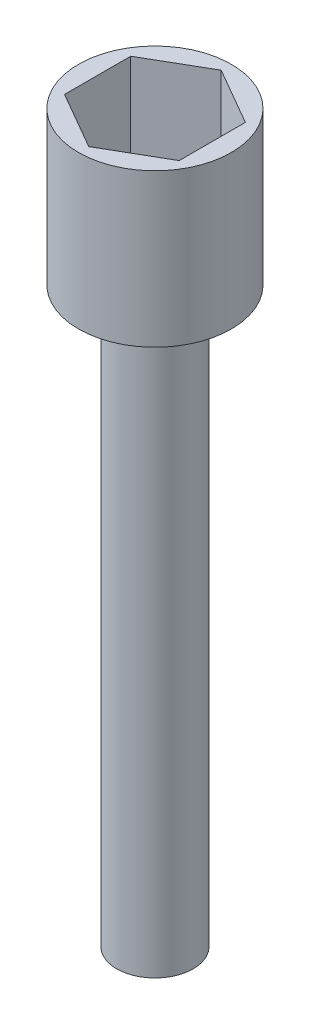
ISO-10303-21;
HEADER;
FILE_DESCRIPTION(('STEP AP214'),'2;1');
FILE_NAME('part.step','',(''),(''),'','','');
FILE_SCHEMA(('AUTOMOTIVE_DESIGN { 1 0 10303 214 1 1 1 1 }'));
ENDSEC;
DATA;
#1=APPLICATION_CONTEXT('core data for automotive mechanical design processes');
#2=APPLICATION_PROTOCOL_DEFINITION('international standard','automotive_design',2000,#1);
#3=PRODUCT_CONTEXT('',#1,'mechanical');
#4=PRODUCT('Part','Part','',(#3));
#5=PRODUCT_RELATED_PRODUCT_CATEGORY('part','',(#4));
#6=PRODUCT_DEFINITION_FORMATION('','',#4);
#7=PRODUCT_DEFINITION_CONTEXT('part definition',#1,'design');
#8=PRODUCT_DEFINITION('design','',#6,#7);
#9=PRODUCT_DEFINITION_SHAPE('','',#8);
#10=(LENGTH_UNIT() NAMED_UNIT(*) SI_UNIT(.MILLI.,.METRE.));
#11=(NAMED_UNIT(*) PLANE_ANGLE_UNIT() SI_UNIT($,.RADIAN.));
#12=(NAMED_UNIT(*) SI_UNIT($,.STERADIAN.) SOLID_ANGLE_UNIT());
#13=UNCERTAINTY_MEASURE_WITH_UNIT(LENGTH_MEASURE(1.E-05),#10,'distance_accuracy_value','');
#14=(GEOMETRIC_REPRESENTATION_CONTEXT(3) GLOBAL_UNCERTAINTY_ASSIGNED_CONTEXT((#13)) GLOBAL_UNIT_ASSIGNED_CONTEXT((#10,
#11,#12)) REPRESENTATION_CONTEXT('',''));
#15=CARTESIAN_POINT('',(0.,0.,0.));
#16=DIRECTION('',(0.,0.,1.));
#17=DIRECTION('',(1.,0.,0.));
#18=AXIS2_PLACEMENT_3D('',#15,#16,#17);
#19=CARTESIAN_POINT('',(0.,15.,0.));
#20=DIRECTION('',(0.,-1.,0.));
#21=DIRECTION('',(0.,0.,-1.));
#22=AXIS2_PLACEMENT_3D('',#19,#20,#21);
#23=CYLINDRICAL_SURFACE('',#22,1.);
#24=CARTESIAN_POINT('',(0.,15.,0.));
#25=DIRECTION('',(0.,1.,0.));
#26=DIRECTION('',(0.,0.,1.));
#27=AXIS2_PLACEMENT_3D('',#24,#25,#26);
#28=CIRCLE('',#27,1.);
#29=CARTESIAN_POINT('',(0.,15.,1.));
#30=VERTEX_POINT('',#29);
#31=EDGE_CURVE('E11',#30,#30,#28,.T.);
#32=ORIENTED_EDGE('',*,*,#31,.F.);
#33=EDGE_LOOP('',(#32));
#34=FACE_BOUND('',#33,.T.);
#35=CARTESIAN_POINT('',(0.,0.,0.));
#36=DIRECTION('',(0.,1.,0.));
#37=DIRECTION('',(0.,0.,1.));
#38=AXIS2_PLACEMENT_3D('',#35,#36,#37);
#39=CIRCLE('',#38,1.);
#40=CARTESIAN_POINT('',(0.,0.,1.));
#41=VERTEX_POINT('',#40);
#42=EDGE_CURVE('E35',#41,#41,#39,.T.);
#43=ORIENTED_EDGE('',*,*,#42,.T.);
#44=EDGE_LOOP('',(#43));
#45=FACE_BOUND('',#44,.T.);
#46=ADVANCED_FACE('F32',(#34,#45),#23,.T.);
#47=CARTESIAN_POINT('',(0.,0.,0.));
#48=DIRECTION('',(0.,1.,0.));
#49=DIRECTION('',(0.,0.,1.));
#50=AXIS2_PLACEMENT_3D('',#47,#48,#49);
#51=PLANE('',#50);
#52=ORIENTED_EDGE('',*,*,#42,.F.);
#53=EDGE_LOOP('',(#52));
#54=FACE_BOUND('',#53,.T.);
#55=ADVANCED_FACE('F150',(#54),#51,.F.);
#56=CARTESIAN_POINT('',(0.,15.,0.));
#57=DIRECTION('',(0.,1.,0.));
#58=DIRECTION('',(0.,0.,1.));
#59=AXIS2_PLACEMENT_3D('',#56,#57,#58);
#60=PLANE('',#59);
#61=CARTESIAN_POINT('',(0.,15.,0.));
#62=DIRECTION('',(0.,1.,0.));
#63=DIRECTION('',(0.,0.,1.));
#64=AXIS2_PLACEMENT_3D('',#61,#62,#63);
#65=CIRCLE('',#64,2.);
#66=CARTESIAN_POINT('',(0.,15.,2.));
#67=VERTEX_POINT('',#66);
#68=EDGE_CURVE('E133',#67,#67,#65,.T.);
#69=ORIENTED_EDGE('',*,*,#68,.F.);
#70=EDGE_LOOP('',(#69));
#71=FACE_BOUND('',#70,.T.);
#72=ORIENTED_EDGE('',*,*,#31,.T.);
#73=EDGE_LOOP('',(#72));
#74=FACE_BOUND('',#73,.T.);
#75=ADVANCED_FACE('F147',(#71,#74),#60,.F.);
#76=CARTESIAN_POINT('',(0.,19.,0.));
#77=DIRECTION('',(0.,-1.,0.));
#78=DIRECTION('',(0.,0.,-1.));
#79=AXIS2_PLACEMENT_3D('',#76,#77,#78);
#80=CYLINDRICAL_SURFACE('',#79,2.);
#81=CARTESIAN_POINT('',(0.,19.,0.));
#82=DIRECTION('',(0.,1.,0.));
#83=DIRECTION('',(0.,0.,1.));
#84=AXIS2_PLACEMENT_3D('',#81,#82,#83);
#85=CIRCLE('',#84,2.);
#86=CARTESIAN_POINT('',(0.,19.,2.));
#87=VERTEX_POINT('',#86);
#88=EDGE_CURVE('E139',#87,#87,#85,.T.);
#89=ORIENTED_EDGE('',*,*,#88,.F.);
#90=EDGE_LOOP('',(#89));
#91=FACE_BOUND('',#90,.T.);
#92=ORIENTED_EDGE('',*,*,#68,.T.);
#93=EDGE_LOOP('',(#92));
#94=FACE_BOUND('',#93,.T.);
#95=ADVANCED_FACE('F145',(#91,#94),#80,.T.);
#96=CARTESIAN_POINT('',(0.,19.,0.));
#97=DIRECTION('',(0.,1.,0.));
#98=DIRECTION('',(0.,0.,1.));
#99=AXIS2_PLACEMENT_3D('',#96,#97,#98);
#100=PLANE('',#99);
#101=DIRECTION('',(-0.866025403784439,0.,-0.5));
#102=VECTOR('',#101,1.);
#103=CARTESIAN_POINT('',(1.5,19.,-0.86602540378444));
#104=LINE('',#103,#102);
#105=CARTESIAN_POINT('',(1.5,19.,-0.86602540378444));
#106=VERTEX_POINT('',#105);
#107=CARTESIAN_POINT('',(0.,19.,-1.73205080756888));
#108=VERTEX_POINT('',#107);
#109=EDGE_CURVE('E46',#106,#108,#104,.T.);
#110=ORIENTED_EDGE('',*,*,#109,.F.);
#111=DIRECTION('',(0.,0.,-1.));
#112=VECTOR('',#111,1.);
#113=CARTESIAN_POINT('',(1.5,19.,0.866025403784438));
#114=LINE('',#113,#112);
#115=CARTESIAN_POINT('',(1.5,19.,0.866025403784438));
#116=VERTEX_POINT('',#115);
#117=EDGE_CURVE('E129',#116,#106,#114,.T.);
#118=ORIENTED_EDGE('',*,*,#117,.F.);
#119=DIRECTION('',(0.866025403784439,0.,-0.5));
#120=VECTOR('',#119,1.);
#121=CARTESIAN_POINT('',(0.,19.,1.73205080756888));
#122=LINE('',#121,#120);
#123=CARTESIAN_POINT('',(0.,19.,1.73205080756888));
#124=VERTEX_POINT('',#123);
#125=EDGE_CURVE('E127',#124,#116,#122,.T.);
#126=ORIENTED_EDGE('',*,*,#125,.F.);
#127=DIRECTION('',(0.866025403784439,0.,0.5));
#128=VECTOR('',#127,1.);
#129=CARTESIAN_POINT('',(-1.5,19.,0.866025403784439));
#130=LINE('',#129,#128);
#131=CARTESIAN_POINT('',(-1.5,19.,0.866025403784439));
#132=VERTEX_POINT('',#131);
#133=EDGE_CURVE('E94',#132,#124,#130,.T.);
#134=ORIENTED_EDGE('',*,*,#133,.F.);
#135=DIRECTION('',(0.,0.,1.));
#136=VECTOR('',#135,1.);
#137=CARTESIAN_POINT('',(-1.5,19.,-0.866025403784438));
#138=LINE('',#137,#136);
#139=CARTESIAN_POINT('',(-1.5,19.,-0.866025403784438));
#140=VERTEX_POINT('',#139);
#141=EDGE_CURVE('E123',#140,#132,#138,.T.);
#142=ORIENTED_EDGE('',*,*,#141,.F.);
#143=DIRECTION('',(-0.866025403784439,0.,0.5));
#144=VECTOR('',#143,1.);
#145=CARTESIAN_POINT('',(0.,19.,-1.73205080756888));
#146=LINE('',#145,#144);
#147=EDGE_CURVE('E120',#108,#140,#146,.T.);
#148=ORIENTED_EDGE('',*,*,#147,.F.);
#149=EDGE_LOOP('',(#110,#118,#126,#134,#142,#148));
#150=FACE_BOUND('',#149,.T.);
#151=ORIENTED_EDGE('',*,*,#88,.T.);
#152=EDGE_LOOP('',(#151));
#153=FACE_BOUND('',#152,.T.);
#154=ADVANCED_FACE('F164',(#150,#153),#100,.T.);
#155=CARTESIAN_POINT('',(1.5,16.,-0.86602540378444));
#156=DIRECTION('',(0.5,0.,-0.866025403784439));
#157=DIRECTION('',(-0.866025403784439,0.,-0.5));
#158=AXIS2_PLACEMENT_3D('',#155,#156,#157);
#159=PLANE('',#158);
#160=ORIENTED_EDGE('',*,*,#109,.T.);
#161=DIRECTION('',(0.,1.,0.));
#162=VECTOR('',#161,1.);
#163=CARTESIAN_POINT('',(0.,16.,-1.73205080756888));
#164=LINE('',#163,#162);
#165=CARTESIAN_POINT('',(0.,16.,-1.73205080756888));
#166=VERTEX_POINT('',#165);
#167=EDGE_CURVE('E76',#166,#108,#164,.T.);
#168=ORIENTED_EDGE('',*,*,#167,.F.);
#169=DIRECTION('',(-0.866025403784439,0.,-0.5));
#170=VECTOR('',#169,1.);
#171=CARTESIAN_POINT('',(1.5,16.,-0.86602540378444));
#172=LINE('',#171,#170);
#173=CARTESIAN_POINT('',(1.5,16.,-0.86602540378444));
#174=VERTEX_POINT('',#173);
#175=EDGE_CURVE('E131',#174,#166,#172,.T.);
#176=ORIENTED_EDGE('',*,*,#175,.F.);
#177=DIRECTION('',(0.,1.,0.));
#178=VECTOR('',#177,1.);
#179=CARTESIAN_POINT('',(1.5,16.,-0.86602540378444));
#180=LINE('',#179,#178);
#181=EDGE_CURVE('E54',#174,#106,#180,.T.);
#182=ORIENTED_EDGE('',*,*,#181,.T.);
#183=EDGE_LOOP('',(#160,#168,#176,#182));
#184=FACE_BOUND('',#183,.T.);
#185=ADVANCED_FACE('F169',(#184),#159,.F.);
#186=CARTESIAN_POINT('',(1.5,16.,0.866025403784438));
#187=DIRECTION('',(1.,0.,0.));
#188=DIRECTION('',(0.,0.,-1.));
#189=AXIS2_PLACEMENT_3D('',#186,#187,#188);
#190=PLANE('',#189);
#191=ORIENTED_EDGE('',*,*,#117,.T.);
#192=ORIENTED_EDGE('',*,*,#181,.F.);
#193=DIRECTION('',(0.,0.,-1.));
#194=VECTOR('',#193,1.);
#195=CARTESIAN_POINT('',(1.5,16.,0.866025403784438));
#196=LINE('',#195,#194);
#197=CARTESIAN_POINT('',(1.5,16.,0.866025403784438));
#198=VERTEX_POINT('',#197);
#199=EDGE_CURVE('E106',#198,#174,#196,.T.);
#200=ORIENTED_EDGE('',*,*,#199,.F.);
#201=DIRECTION('',(0.,1.,0.));
#202=VECTOR('',#201,1.);
#203=CARTESIAN_POINT('',(1.5,16.,0.866025403784438));
#204=LINE('',#203,#202);
#205=EDGE_CURVE('E98',#198,#116,#204,.T.);
#206=ORIENTED_EDGE('',*,*,#205,.T.);
#207=EDGE_LOOP('',(#191,#192,#200,#206));
#208=FACE_BOUND('',#207,.T.);
#209=ADVANCED_FACE('F173',(#208),#190,.F.);
#210=CARTESIAN_POINT('',(0.,16.,1.73205080756888));
#211=DIRECTION('',(0.5,0.,0.866025403784439));
#212=DIRECTION('',(0.866025403784439,0.,-0.5));
#213=AXIS2_PLACEMENT_3D('',#210,#211,#212);
#214=PLANE('',#213);
#215=ORIENTED_EDGE('',*,*,#125,.T.);
#216=ORIENTED_EDGE('',*,*,#205,.F.);
#217=DIRECTION('',(0.866025403784439,0.,-0.5));
#218=VECTOR('',#217,1.);
#219=CARTESIAN_POINT('',(0.,16.,1.73205080756888));
#220=LINE('',#219,#218);
#221=CARTESIAN_POINT('',(0.,16.,1.73205080756888));
#222=VERTEX_POINT('',#221);
#223=EDGE_CURVE('E102',#222,#198,#220,.T.);
#224=ORIENTED_EDGE('',*,*,#223,.F.);
#225=DIRECTION('',(0.,1.,0.));
#226=VECTOR('',#225,1.);
#227=CARTESIAN_POINT('',(0.,16.,1.73205080756888));
#228=LINE('',#227,#226);
#229=EDGE_CURVE('E87',#222,#124,#228,.T.);
#230=ORIENTED_EDGE('',*,*,#229,.T.);
#231=EDGE_LOOP('',(#215,#216,#224,#230));
#232=FACE_BOUND('',#231,.T.);
#233=ADVANCED_FACE('F103',(#232),#214,.F.);
#234=CARTESIAN_POINT('',(-1.5,16.,0.866025403784439));
#235=DIRECTION('',(-0.5,0.,0.866025403784439));
#236=DIRECTION('',(0.866025403784439,0.,0.5));
#237=AXIS2_PLACEMENT_3D('',#234,#235,#236);
#238=PLANE('',#237);
#239=ORIENTED_EDGE('',*,*,#133,.T.);
#240=ORIENTED_EDGE('',*,*,#229,.F.);
#241=DIRECTION('',(0.866025403784439,0.,0.5));
#242=VECTOR('',#241,1.);
#243=CARTESIAN_POINT('',(-1.5,16.,0.866025403784439));
#244=LINE('',#243,#242);
#245=CARTESIAN_POINT('',(-1.5,16.,0.866025403784439));
#246=VERTEX_POINT('',#245);
#247=EDGE_CURVE('E91',#246,#222,#244,.T.);
#248=ORIENTED_EDGE('',*,*,#247,.F.);
#249=DIRECTION('',(0.,1.,0.));
#250=VECTOR('',#249,1.);
#251=CARTESIAN_POINT('',(-1.5,16.,0.866025403784439));
#252=LINE('',#251,#250);
#253=EDGE_CURVE('E99',#246,#132,#252,.T.);
#254=ORIENTED_EDGE('',*,*,#253,.T.);
#255=EDGE_LOOP('',(#239,#240,#248,#254));
#256=FACE_BOUND('',#255,.T.);
#257=ADVANCED_FACE('F89',(#256),#238,.F.);
#258=CARTESIAN_POINT('',(-1.5,16.,-0.866025403784438));
#259=DIRECTION('',(-1.,0.,0.));
#260=DIRECTION('',(0.,0.,1.));
#261=AXIS2_PLACEMENT_3D('',#258,#259,#260);
#262=PLANE('',#261);
#263=ORIENTED_EDGE('',*,*,#141,.T.);
#264=ORIENTED_EDGE('',*,*,#253,.F.);
#265=DIRECTION('',(0.,0.,1.));
#266=VECTOR('',#265,1.);
#267=CARTESIAN_POINT('',(-1.5,16.,-0.866025403784438));
#268=LINE('',#267,#266);
#269=CARTESIAN_POINT('',(-1.5,16.,-0.866025403784438));
#270=VERTEX_POINT('',#269);
#271=EDGE_CURVE('E112',#270,#246,#268,.T.);
#272=ORIENTED_EDGE('',*,*,#271,.F.);
#273=DIRECTION('',(0.,1.,0.));
#274=VECTOR('',#273,1.);
#275=CARTESIAN_POINT('',(-1.5,16.,-0.866025403784438));
#276=LINE('',#275,#274);
#277=EDGE_CURVE('E136',#270,#140,#276,.T.);
#278=ORIENTED_EDGE('',*,*,#277,.T.);
#279=EDGE_LOOP('',(#263,#264,#272,#278));
#280=FACE_BOUND('',#279,.T.);
#281=ADVANCED_FACE('F177',(#280),#262,.F.);
#282=CARTESIAN_POINT('',(0.,16.,-1.73205080756888));
#283=DIRECTION('',(-0.5,0.,-0.866025403784438));
#284=DIRECTION('',(-0.866025403784439,0.,0.5));
#285=AXIS2_PLACEMENT_3D('',#282,#283,#284);
#286=PLANE('',#285);
#287=ORIENTED_EDGE('',*,*,#147,.T.);
#288=ORIENTED_EDGE('',*,*,#277,.F.);
#289=DIRECTION('',(-0.866025403784439,0.,0.5));
#290=VECTOR('',#289,1.);
#291=CARTESIAN_POINT('',(0.,16.,-1.73205080756888));
#292=LINE('',#291,#290);
#293=EDGE_CURVE('E114',#166,#270,#292,.T.);
#294=ORIENTED_EDGE('',*,*,#293,.F.);
#295=ORIENTED_EDGE('',*,*,#167,.T.);
#296=EDGE_LOOP('',(#287,#288,#294,#295));
#297=FACE_BOUND('',#296,.T.);
#298=ADVANCED_FACE('F174',(#297),#286,.F.);
#299=CARTESIAN_POINT('',(0.,16.,0.));
#300=DIRECTION('',(0.,1.,0.));
#301=DIRECTION('',(0.,0.,1.));
#302=AXIS2_PLACEMENT_3D('',#299,#300,#301);
#303=PLANE('',#302);
#304=ORIENTED_EDGE('',*,*,#175,.T.);
#305=ORIENTED_EDGE('',*,*,#293,.T.);
#306=ORIENTED_EDGE('',*,*,#271,.T.);
#307=ORIENTED_EDGE('',*,*,#247,.T.);
#308=ORIENTED_EDGE('',*,*,#223,.T.);
#309=ORIENTED_EDGE('',*,*,#199,.T.);
#310=EDGE_LOOP('',(#304,#305,#306,#307,#308,#309));
#311=FACE_BOUND('',#310,.T.);
#312=ADVANCED_FACE('F109',(#311),#303,.T.);
#313=CLOSED_SHELL('',(#46,#55,#75,#95,#154,#185,#209,#233,#257,#281,#298,#312));
#314=MANIFOLD_SOLID_BREP('B2',#313);
#315=ADVANCED_BREP_SHAPE_REPRESENTATION('',(#18,#314),#14);
#316=SHAPE_DEFINITION_REPRESENTATION(#9,#315);
ENDSEC;
END-ISO-10303-21;
